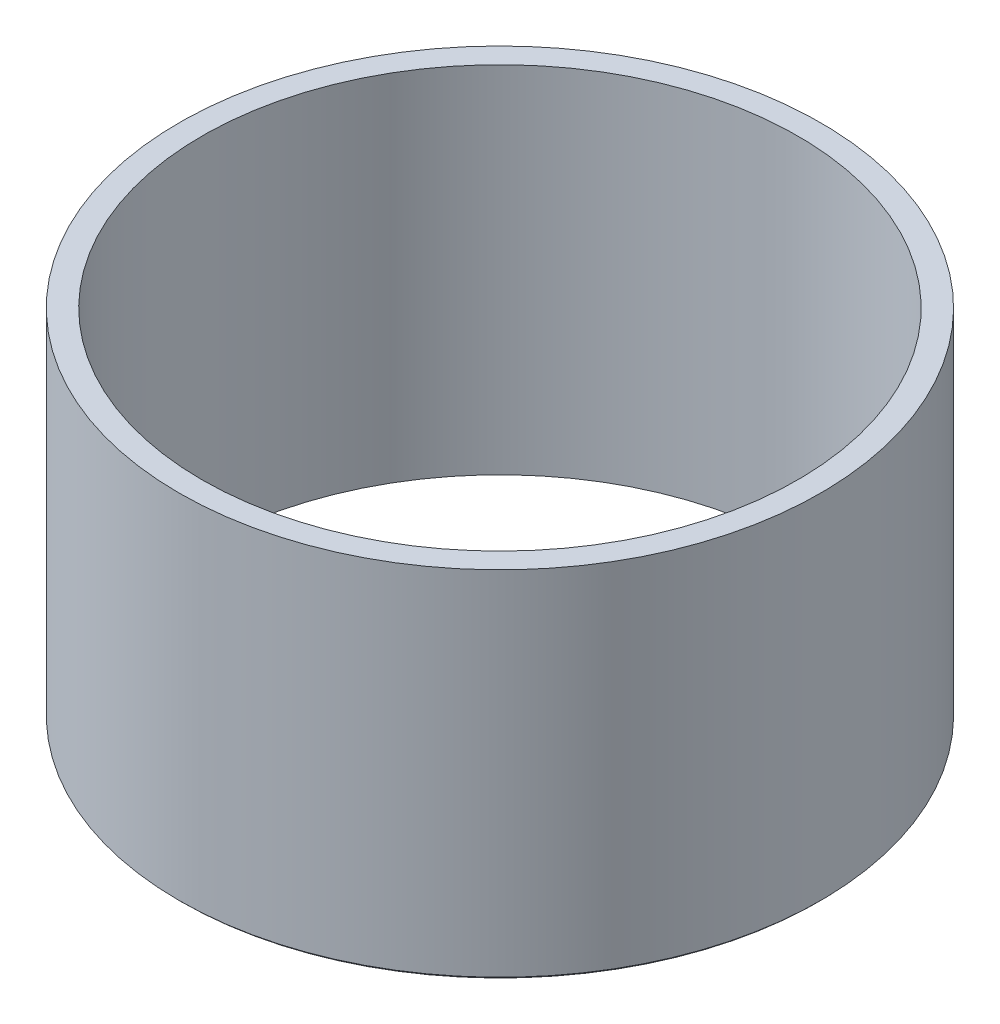
ISO-10303-21;
HEADER;
FILE_DESCRIPTION(('STEP AP214'),'2;1');
FILE_NAME('part.step','',(''),(''),'','','');
FILE_SCHEMA(('AUTOMOTIVE_DESIGN { 1 0 10303 214 1 1 1 1 }'));
ENDSEC;
DATA;
#1=APPLICATION_CONTEXT('core data for automotive mechanical design processes');
#2=APPLICATION_PROTOCOL_DEFINITION('international standard','automotive_design',2000,#1);
#3=PRODUCT_CONTEXT('',#1,'mechanical');
#4=PRODUCT('Part','Part','',(#3));
#5=PRODUCT_RELATED_PRODUCT_CATEGORY('part','',(#4));
#6=PRODUCT_DEFINITION_FORMATION('','',#4);
#7=PRODUCT_DEFINITION_CONTEXT('part definition',#1,'design');
#8=PRODUCT_DEFINITION('design','',#6,#7);
#9=PRODUCT_DEFINITION_SHAPE('','',#8);
#10=(LENGTH_UNIT() NAMED_UNIT(*) SI_UNIT(.MILLI.,.METRE.));
#11=(NAMED_UNIT(*) PLANE_ANGLE_UNIT() SI_UNIT($,.RADIAN.));
#12=(NAMED_UNIT(*) SI_UNIT($,.STERADIAN.) SOLID_ANGLE_UNIT());
#13=UNCERTAINTY_MEASURE_WITH_UNIT(LENGTH_MEASURE(1.E-05),#10,'distance_accuracy_value','');
#14=(GEOMETRIC_REPRESENTATION_CONTEXT(3) GLOBAL_UNCERTAINTY_ASSIGNED_CONTEXT((#13)) GLOBAL_UNIT_ASSIGNED_CONTEXT((#10,
#11,#12)) REPRESENTATION_CONTEXT('',''));
#15=CARTESIAN_POINT('',(0.,0.,0.));
#16=DIRECTION('',(0.,0.,1.));
#17=DIRECTION('',(1.,0.,0.));
#18=AXIS2_PLACEMENT_3D('',#15,#16,#17);
#19=CARTESIAN_POINT('',(0.,15.5,0.));
#20=DIRECTION('',(0.,1.,0.));
#21=DIRECTION('',(0.,0.,1.));
#22=AXIS2_PLACEMENT_3D('',#19,#20,#21);
#23=PLANE('',#22);
#24=CARTESIAN_POINT('',(0.,15.5,0.));
#25=DIRECTION('',(0.,1.,0.));
#26=DIRECTION('',(0.,0.,1.));
#27=AXIS2_PLACEMENT_3D('',#24,#25,#26);
#28=CIRCLE('',#27,14.);
#29=CARTESIAN_POINT('',(0.,15.5,14.));
#30=VERTEX_POINT('',#29);
#31=EDGE_CURVE('E49',#30,#30,#28,.T.);
#32=ORIENTED_EDGE('',*,*,#31,.T.);
#33=EDGE_LOOP('',(#32));
#34=FACE_BOUND('',#33,.T.);
#35=CARTESIAN_POINT('',(0.,15.5,0.));
#36=DIRECTION('',(0.,1.,0.));
#37=DIRECTION('',(0.,0.,1.));
#38=AXIS2_PLACEMENT_3D('',#35,#36,#37);
#39=CIRCLE('',#38,13.);
#40=CARTESIAN_POINT('',(0.,15.5,13.));
#41=VERTEX_POINT('',#40);
#42=EDGE_CURVE('E53',#41,#41,#39,.T.);
#43=ORIENTED_EDGE('',*,*,#42,.F.);
#44=EDGE_LOOP('',(#43));
#45=FACE_BOUND('',#44,.T.);
#46=ADVANCED_FACE('F38',(#34,#45),#23,.T.);
#47=CARTESIAN_POINT('',(0.,0.,0.));
#48=DIRECTION('',(0.,1.,0.));
#49=DIRECTION('',(0.,0.,1.));
#50=AXIS2_PLACEMENT_3D('',#47,#48,#49);
#51=PLANE('',#50);
#52=CARTESIAN_POINT('',(0.,0.,0.));
#53=DIRECTION('',(0.,1.,0.));
#54=DIRECTION('',(0.,0.,1.));
#55=AXIS2_PLACEMENT_3D('',#52,#53,#54);
#56=CIRCLE('',#55,13.9);
#57=CARTESIAN_POINT('',(0.,0.,13.9));
#58=VERTEX_POINT('',#57);
#59=EDGE_CURVE('E10',#58,#58,#56,.F.);
#60=ORIENTED_EDGE('',*,*,#59,.T.);
#61=EDGE_LOOP('',(#60));
#62=FACE_BOUND('',#61,.T.);
#63=CARTESIAN_POINT('',(0.,0.,0.));
#64=DIRECTION('',(0.,1.,0.));
#65=DIRECTION('',(0.,0.,1.));
#66=AXIS2_PLACEMENT_3D('',#63,#64,#65);
#67=CIRCLE('',#66,13.);
#68=CARTESIAN_POINT('',(0.,0.,13.));
#69=VERTEX_POINT('',#68);
#70=EDGE_CURVE('E56',#69,#69,#67,.T.);
#71=ORIENTED_EDGE('',*,*,#70,.T.);
#72=EDGE_LOOP('',(#71));
#73=FACE_BOUND('',#72,.T.);
#74=ADVANCED_FACE('F66',(#62,#73),#51,.F.);
#75=CARTESIAN_POINT('',(0.,15.5,0.));
#76=DIRECTION('',(0.,-1.,0.));
#77=DIRECTION('',(0.,0.,-1.));
#78=AXIS2_PLACEMENT_3D('',#75,#76,#77);
#79=CYLINDRICAL_SURFACE('',#78,14.);
#80=CARTESIAN_POINT('',(0.,0.100000000000005,0.));
#81=DIRECTION('',(0.,1.,0.));
#82=DIRECTION('',(0.,0.,1.));
#83=AXIS2_PLACEMENT_3D('',#80,#81,#82);
#84=CIRCLE('',#83,14.);
#85=CARTESIAN_POINT('',(0.,0.100000000000005,14.));
#86=VERTEX_POINT('',#85);
#87=EDGE_CURVE('E45',#86,#86,#84,.T.);
#88=ORIENTED_EDGE('',*,*,#87,.T.);
#89=EDGE_LOOP('',(#88));
#90=FACE_BOUND('',#89,.T.);
#91=ORIENTED_EDGE('',*,*,#31,.F.);
#92=EDGE_LOOP('',(#91));
#93=FACE_BOUND('',#92,.T.);
#94=ADVANCED_FACE('F72',(#90,#93),#79,.T.);
#95=CARTESIAN_POINT('',(0.,15.5,0.));
#96=DIRECTION('',(0.,-1.,0.));
#97=DIRECTION('',(0.,0.,-1.));
#98=AXIS2_PLACEMENT_3D('',#95,#96,#97);
#99=CYLINDRICAL_SURFACE('',#98,13.);
#100=ORIENTED_EDGE('',*,*,#42,.T.);
#101=EDGE_LOOP('',(#100));
#102=FACE_BOUND('',#101,.T.);
#103=ORIENTED_EDGE('',*,*,#70,.F.);
#104=EDGE_LOOP('',(#103));
#105=FACE_BOUND('',#104,.T.);
#106=ADVANCED_FACE('F62',(#102,#105),#99,.F.);
#107=CARTESIAN_POINT('',(0.,0.100000000000005,0.));
#108=DIRECTION('',(0.,1.,0.));
#109=DIRECTION('',(0.,0.,1.));
#110=AXIS2_PLACEMENT_3D('',#107,#108,#109);
#111=CONICAL_SURFACE('',#110,14.,0.785398163397448);
#112=ORIENTED_EDGE('',*,*,#59,.F.);
#113=EDGE_LOOP('',(#112));
#114=FACE_BOUND('',#113,.T.);
#115=ORIENTED_EDGE('',*,*,#87,.F.);
#116=EDGE_LOOP('',(#115));
#117=FACE_BOUND('',#116,.T.);
#118=ADVANCED_FACE('F40',(#114,#117),#111,.T.);
#119=CLOSED_SHELL('',(#46,#74,#94,#106,#118));
#120=MANIFOLD_SOLID_BREP('B2',#119);
#121=ADVANCED_BREP_SHAPE_REPRESENTATION('',(#18,#120),#14);
#122=SHAPE_DEFINITION_REPRESENTATION(#9,#121);
ENDSEC;
END-ISO-10303-21;
